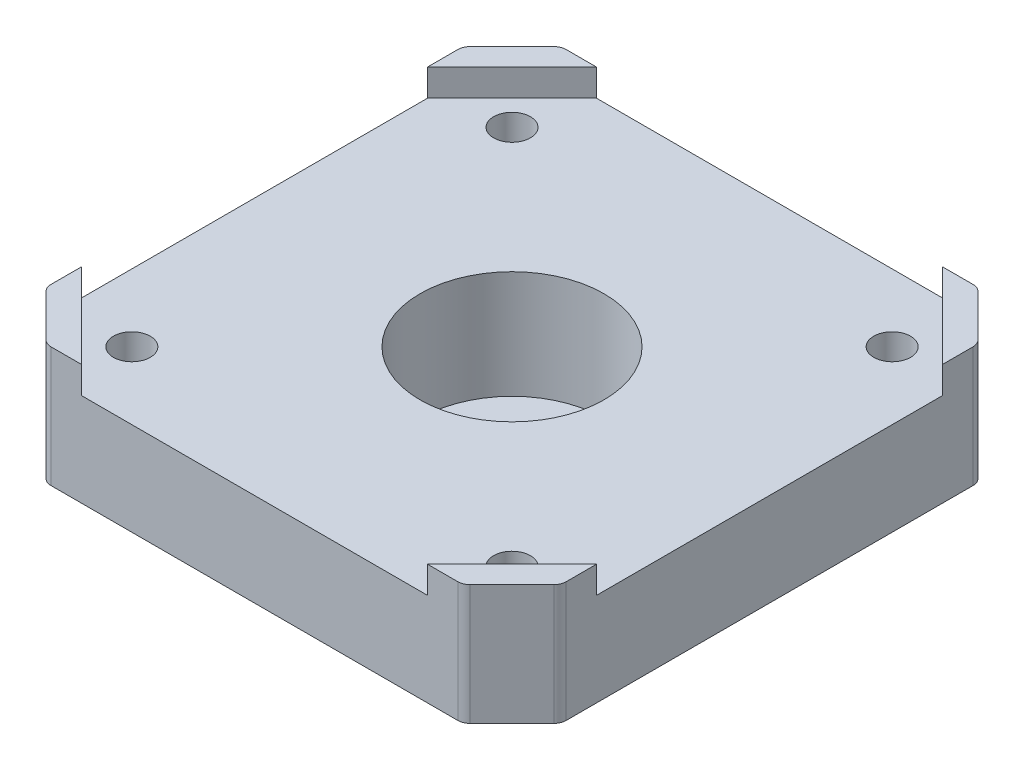
ISO-10303-21;
HEADER;
FILE_DESCRIPTION(('STEP AP214'),'2;1');
FILE_NAME('part.step','',(''),(''),'','','');
FILE_SCHEMA(('AUTOMOTIVE_DESIGN { 1 0 10303 214 1 1 1 1 }'));
ENDSEC;
DATA;
#1=APPLICATION_CONTEXT('core data for automotive mechanical design processes');
#2=APPLICATION_PROTOCOL_DEFINITION('international standard','automotive_design',2000,#1);
#3=PRODUCT_CONTEXT('',#1,'mechanical');
#4=PRODUCT('Part','Part','',(#3));
#5=PRODUCT_RELATED_PRODUCT_CATEGORY('part','',(#4));
#6=PRODUCT_DEFINITION_FORMATION('','',#4);
#7=PRODUCT_DEFINITION_CONTEXT('part definition',#1,'design');
#8=PRODUCT_DEFINITION('design','',#6,#7);
#9=PRODUCT_DEFINITION_SHAPE('','',#8);
#10=(LENGTH_UNIT() NAMED_UNIT(*) SI_UNIT(.MILLI.,.METRE.));
#11=(NAMED_UNIT(*) PLANE_ANGLE_UNIT() SI_UNIT($,.RADIAN.));
#12=(NAMED_UNIT(*) SI_UNIT($,.STERADIAN.) SOLID_ANGLE_UNIT());
#13=UNCERTAINTY_MEASURE_WITH_UNIT(LENGTH_MEASURE(1.E-05),#10,'distance_accuracy_value','');
#14=(GEOMETRIC_REPRESENTATION_CONTEXT(3) GLOBAL_UNCERTAINTY_ASSIGNED_CONTEXT((#13)) GLOBAL_UNIT_ASSIGNED_CONTEXT((#10,
#11,#12)) REPRESENTATION_CONTEXT('',''));
#15=CARTESIAN_POINT('',(0.,0.,0.));
#16=DIRECTION('',(0.,0.,1.));
#17=DIRECTION('',(1.,0.,0.));
#18=AXIS2_PLACEMENT_3D('',#15,#16,#17);
#19=CARTESIAN_POINT('',(0.,-2.20000000000001,0.));
#20=DIRECTION('',(0.,1.,0.));
#21=DIRECTION('',(0.,0.,1.));
#22=AXIS2_PLACEMENT_3D('',#19,#20,#21);
#23=PLANE('',#22);
#24=CARTESIAN_POINT('',(15.5,-2.20000000000001,15.5));
#25=DIRECTION('',(0.,1.,0.));
#26=DIRECTION('',(0.,0.,1.));
#27=AXIS2_PLACEMENT_3D('',#24,#25,#26);
#28=CIRCLE('',#27,1.49999999999999);
#29=CARTESIAN_POINT('',(15.5,-2.20000000000001,17.));
#30=VERTEX_POINT('',#29);
#31=EDGE_CURVE('E512',#30,#30,#28,.T.);
#32=ORIENTED_EDGE('',*,*,#31,.F.);
#33=EDGE_LOOP('',(#32));
#34=FACE_BOUND('',#33,.T.);
#35=CARTESIAN_POINT('',(15.5,-2.2,-15.5));
#36=DIRECTION('',(0.,1.,0.));
#37=DIRECTION('',(0.,0.,1.));
#38=AXIS2_PLACEMENT_3D('',#35,#36,#37);
#39=CIRCLE('',#38,1.49999999999999);
#40=CARTESIAN_POINT('',(15.5,-2.2,-14.));
#41=VERTEX_POINT('',#40);
#42=EDGE_CURVE('E506',#41,#41,#39,.T.);
#43=ORIENTED_EDGE('',*,*,#42,.F.);
#44=EDGE_LOOP('',(#43));
#45=FACE_BOUND('',#44,.T.);
#46=CARTESIAN_POINT('',(-15.5,-2.20000000000001,15.5));
#47=DIRECTION('',(0.,1.,0.));
#48=DIRECTION('',(0.,0.,1.));
#49=AXIS2_PLACEMENT_3D('',#46,#47,#48);
#50=CIRCLE('',#49,1.49999999999999);
#51=CARTESIAN_POINT('',(-15.5,-2.20000000000001,17.));
#52=VERTEX_POINT('',#51);
#53=EDGE_CURVE('E500',#52,#52,#50,.T.);
#54=ORIENTED_EDGE('',*,*,#53,.F.);
#55=EDGE_LOOP('',(#54));
#56=FACE_BOUND('',#55,.T.);
#57=CARTESIAN_POINT('',(-15.5,-2.2,-15.5));
#58=DIRECTION('',(0.,1.,0.));
#59=DIRECTION('',(0.,0.,1.));
#60=AXIS2_PLACEMENT_3D('',#57,#58,#59);
#61=CIRCLE('',#60,1.49999999999999);
#62=CARTESIAN_POINT('',(-15.5,-2.2,-14.));
#63=VERTEX_POINT('',#62);
#64=EDGE_CURVE('E494',#63,#63,#61,.T.);
#65=ORIENTED_EDGE('',*,*,#64,.F.);
#66=EDGE_LOOP('',(#65));
#67=FACE_BOUND('',#66,.T.);
#68=CARTESIAN_POINT('',(0.,-2.20000000000001,0.));
#69=DIRECTION('',(0.,1.,0.));
#70=DIRECTION('',(0.,0.,1.));
#71=AXIS2_PLACEMENT_3D('',#68,#69,#70);
#72=CIRCLE('',#71,7.5);
#73=CARTESIAN_POINT('',(0.,-2.20000000000001,7.5));
#74=VERTEX_POINT('',#73);
#75=EDGE_CURVE('E488',#74,#74,#72,.T.);
#76=ORIENTED_EDGE('',*,*,#75,.F.);
#77=EDGE_LOOP('',(#76));
#78=FACE_BOUND('',#77,.T.);
#79=DIRECTION('',(0.,0.,1.));
#80=VECTOR('',#79,1.);
#81=CARTESIAN_POINT('',(-21.,-2.2,-14.1007806181));
#82=LINE('',#81,#80);
#83=CARTESIAN_POINT('',(-21.,-2.2,-14.1007806181));
#84=VERTEX_POINT('',#83);
#85=CARTESIAN_POINT('',(-21.,-2.20000000000001,14.1007806181));
#86=VERTEX_POINT('',#85);
#87=EDGE_CURVE('E256',#84,#86,#82,.T.);
#88=ORIENTED_EDGE('',*,*,#87,.T.);
#89=DIRECTION('',(-0.707106781186547,0.,-0.707106781186547));
#90=VECTOR('',#89,1.);
#91=CARTESIAN_POINT('',(-21.,-2.20000000000001,14.1007806181));
#92=LINE('',#91,#90);
#93=CARTESIAN_POINT('',(-14.1007806181,-2.20000000000001,21.));
#94=VERTEX_POINT('',#93);
#95=EDGE_CURVE('E207',#94,#86,#92,.T.);
#96=ORIENTED_EDGE('',*,*,#95,.F.);
#97=DIRECTION('',(1.,0.,0.));
#98=VECTOR('',#97,1.);
#99=CARTESIAN_POINT('',(-17.,-2.20000000000001,21.));
#100=LINE('',#99,#98);
#101=CARTESIAN_POINT('',(14.1007806181,-2.20000000000001,21.));
#102=VERTEX_POINT('',#101);
#103=EDGE_CURVE('E222',#94,#102,#100,.T.);
#104=ORIENTED_EDGE('',*,*,#103,.T.);
#105=DIRECTION('',(-0.707106781186547,0.,0.707106781186547));
#106=VECTOR('',#105,1.);
#107=CARTESIAN_POINT('',(14.1007806181,-2.20000000000001,21.));
#108=LINE('',#107,#106);
#109=CARTESIAN_POINT('',(21.,-2.20000000000001,14.1007806181));
#110=VERTEX_POINT('',#109);
#111=EDGE_CURVE('E223',#110,#102,#108,.T.);
#112=ORIENTED_EDGE('',*,*,#111,.F.);
#113=DIRECTION('',(0.,0.,-1.));
#114=VECTOR('',#113,1.);
#115=CARTESIAN_POINT('',(21.,-2.20000000000001,17.));
#116=LINE('',#115,#114);
#117=CARTESIAN_POINT('',(21.,-2.2,-14.1007806181));
#118=VERTEX_POINT('',#117);
#119=EDGE_CURVE('E259',#110,#118,#116,.T.);
#120=ORIENTED_EDGE('',*,*,#119,.T.);
#121=DIRECTION('',(-0.707106781186547,0.,-0.707106781186547));
#122=VECTOR('',#121,1.);
#123=CARTESIAN_POINT('',(21.,-2.2,-14.1007806181));
#124=LINE('',#123,#122);
#125=CARTESIAN_POINT('',(14.1007806181,-2.2,-21.));
#126=VERTEX_POINT('',#125);
#127=EDGE_CURVE('E246',#118,#126,#124,.T.);
#128=ORIENTED_EDGE('',*,*,#127,.T.);
#129=DIRECTION('',(-1.,0.,0.));
#130=VECTOR('',#129,1.);
#131=CARTESIAN_POINT('',(14.1007806181,-2.2,-21.));
#132=LINE('',#131,#130);
#133=CARTESIAN_POINT('',(-14.1007806181,-2.2,-21.));
#134=VERTEX_POINT('',#133);
#135=EDGE_CURVE('E249',#126,#134,#132,.T.);
#136=ORIENTED_EDGE('',*,*,#135,.T.);
#137=DIRECTION('',(-0.707106781186547,0.,0.707106781186547));
#138=VECTOR('',#137,1.);
#139=CARTESIAN_POINT('',(-14.1007806181,-2.2,-21.));
#140=LINE('',#139,#138);
#141=EDGE_CURVE('E253',#134,#84,#140,.T.);
#142=ORIENTED_EDGE('',*,*,#141,.T.);
#143=EDGE_LOOP('',(#88,#96,#104,#112,#120,#128,#136,#142));
#144=FACE_BOUND('',#143,.T.);
#145=ADVANCED_FACE('F35',(#34,#45,#56,#67,#78,#144),#23,.T.);
#146=CARTESIAN_POINT('',(17.,-9.79999999999999,21.));
#147=DIRECTION('',(0.707106781186548,0.,0.707106781186547));
#148=DIRECTION('',(0.707106781186547,0.,-0.707106781186548));
#149=AXIS2_PLACEMENT_3D('',#146,#147,#148);
#150=PLANE('',#149);
#151=DIRECTION('',(0.707106781186547,0.,-0.707106781186548));
#152=VECTOR('',#151,1.);
#153=CARTESIAN_POINT('',(21.,0.,17.));
#154=LINE('',#153,#152);
#155=CARTESIAN_POINT('',(17.2928932188135,0.,20.7071067811865));
#156=VERTEX_POINT('',#155);
#157=CARTESIAN_POINT('',(20.7071067811865,0.,17.2928932188135));
#158=VERTEX_POINT('',#157);
#159=EDGE_CURVE('E234',#156,#158,#154,.T.);
#160=ORIENTED_EDGE('',*,*,#159,.F.);
#161=DIRECTION('',(0.,1.,0.));
#162=VECTOR('',#161,1.);
#163=CARTESIAN_POINT('',(17.2928932188135,-9.79999999999999,20.7071067811865));
#164=LINE('',#163,#162);
#165=CARTESIAN_POINT('',(17.2928932188135,-9.79999999999999,20.7071067811865));
#166=VERTEX_POINT('',#165);
#167=EDGE_CURVE('E372',#156,#166,#164,.F.);
#168=ORIENTED_EDGE('',*,*,#167,.T.);
#169=DIRECTION('',(0.707106781186547,0.,-0.707106781186548));
#170=VECTOR('',#169,1.);
#171=CARTESIAN_POINT('',(17.,-9.79999999999999,21.));
#172=LINE('',#171,#170);
#173=CARTESIAN_POINT('',(20.7071067811865,-9.79999999999999,17.2928932188135));
#174=VERTEX_POINT('',#173);
#175=EDGE_CURVE('E289',#166,#174,#172,.T.);
#176=ORIENTED_EDGE('',*,*,#175,.T.);
#177=DIRECTION('',(0.,1.,0.));
#178=VECTOR('',#177,1.);
#179=CARTESIAN_POINT('',(20.7071067811865,-9.79999999999999,17.2928932188135));
#180=LINE('',#179,#178);
#181=EDGE_CURVE('E369',#174,#158,#180,.T.);
#182=ORIENTED_EDGE('',*,*,#181,.T.);
#183=EDGE_LOOP('',(#160,#168,#176,#182));
#184=FACE_BOUND('',#183,.T.);
#185=ADVANCED_FACE('F447',(#184),#150,.T.);
#186=CARTESIAN_POINT('',(-17.,-9.79999999999999,21.));
#187=DIRECTION('',(0.,0.,1.));
#188=DIRECTION('',(1.,0.,0.));
#189=AXIS2_PLACEMENT_3D('',#186,#187,#188);
#190=PLANE('',#189);
#191=DIRECTION('',(1.,0.,0.));
#192=VECTOR('',#191,1.);
#193=CARTESIAN_POINT('',(-14.1007806181,0.,21.));
#194=LINE('',#193,#192);
#195=CARTESIAN_POINT('',(-16.5857864376269,0.,21.));
#196=VERTEX_POINT('',#195);
#197=CARTESIAN_POINT('',(-14.1007806181,0.,21.));
#198=VERTEX_POINT('',#197);
#199=EDGE_CURVE('E196',#196,#198,#194,.T.);
#200=ORIENTED_EDGE('',*,*,#199,.F.);
#201=DIRECTION('',(0.,1.,0.));
#202=VECTOR('',#201,1.);
#203=CARTESIAN_POINT('',(-16.5857864376269,-9.79999999999999,21.));
#204=LINE('',#203,#202);
#205=CARTESIAN_POINT('',(-16.5857864376269,-9.79999999999999,21.));
#206=VERTEX_POINT('',#205);
#207=EDGE_CURVE('E328',#196,#206,#204,.F.);
#208=ORIENTED_EDGE('',*,*,#207,.T.);
#209=DIRECTION('',(1.,0.,0.));
#210=VECTOR('',#209,1.);
#211=CARTESIAN_POINT('',(-17.,-9.79999999999999,21.));
#212=LINE('',#211,#210);
#213=CARTESIAN_POINT('',(16.5857864376269,-9.79999999999999,21.));
#214=VERTEX_POINT('',#213);
#215=EDGE_CURVE('E286',#206,#214,#212,.T.);
#216=ORIENTED_EDGE('',*,*,#215,.T.);
#217=DIRECTION('',(0.,1.,0.));
#218=VECTOR('',#217,1.);
#219=CARTESIAN_POINT('',(16.5857864376269,-9.79999999999999,21.));
#220=LINE('',#219,#218);
#221=CARTESIAN_POINT('',(16.5857864376269,0.,21.));
#222=VERTEX_POINT('',#221);
#223=EDGE_CURVE('E325',#214,#222,#220,.T.);
#224=ORIENTED_EDGE('',*,*,#223,.T.);
#225=DIRECTION('',(1.,0.,0.));
#226=VECTOR('',#225,1.);
#227=CARTESIAN_POINT('',(17.,0.,21.));
#228=LINE('',#227,#226);
#229=CARTESIAN_POINT('',(14.1007806181,0.,21.));
#230=VERTEX_POINT('',#229);
#231=EDGE_CURVE('E226',#230,#222,#228,.T.);
#232=ORIENTED_EDGE('',*,*,#231,.F.);
#233=DIRECTION('',(0.,-1.,0.));
#234=VECTOR('',#233,1.);
#235=CARTESIAN_POINT('',(14.1007806181,0.,21.));
#236=LINE('',#235,#234);
#237=EDGE_CURVE('E240',#230,#102,#236,.T.);
#238=ORIENTED_EDGE('',*,*,#237,.T.);
#239=ORIENTED_EDGE('',*,*,#103,.F.);
#240=DIRECTION('',(0.,-1.,0.));
#241=VECTOR('',#240,1.);
#242=CARTESIAN_POINT('',(-14.1007806181,0.,21.));
#243=LINE('',#242,#241);
#244=EDGE_CURVE('E213',#198,#94,#243,.T.);
#245=ORIENTED_EDGE('',*,*,#244,.F.);
#246=EDGE_LOOP('',(#200,#208,#216,#224,#232,#238,#239,#245));
#247=FACE_BOUND('',#246,.T.);
#248=ADVANCED_FACE('F220',(#247),#190,.T.);
#249=CARTESIAN_POINT('',(-21.,-9.79999999999999,17.));
#250=DIRECTION('',(-0.707106781186548,0.,0.707106781186548));
#251=DIRECTION('',(0.707106781186548,0.,0.707106781186548));
#252=AXIS2_PLACEMENT_3D('',#249,#250,#251);
#253=PLANE('',#252);
#254=DIRECTION('',(0.707106781186547,0.,0.707106781186547));
#255=VECTOR('',#254,1.);
#256=CARTESIAN_POINT('',(-21.,-9.79999999999999,17.));
#257=LINE('',#256,#255);
#258=CARTESIAN_POINT('',(-20.7071067811866,-9.79999999999999,17.2928932188134));
#259=VERTEX_POINT('',#258);
#260=CARTESIAN_POINT('',(-17.2928932188135,-9.79999999999999,20.7071067811865));
#261=VERTEX_POINT('',#260);
#262=EDGE_CURVE('E283',#259,#261,#257,.T.);
#263=ORIENTED_EDGE('',*,*,#262,.T.);
#264=DIRECTION('',(0.,1.,0.));
#265=VECTOR('',#264,1.);
#266=CARTESIAN_POINT('',(-17.2928932188135,-9.79999999999999,20.7071067811865));
#267=LINE('',#266,#265);
#268=CARTESIAN_POINT('',(-17.2928932188135,0.,20.7071067811865));
#269=VERTEX_POINT('',#268);
#270=EDGE_CURVE('E319',#261,#269,#267,.T.);
#271=ORIENTED_EDGE('',*,*,#270,.T.);
#272=DIRECTION('',(0.707106781186547,0.,0.707106781186547));
#273=VECTOR('',#272,1.);
#274=CARTESIAN_POINT('',(-17.,0.,21.));
#275=LINE('',#274,#273);
#276=CARTESIAN_POINT('',(-20.7071067811866,0.,17.2928932188134));
#277=VERTEX_POINT('',#276);
#278=EDGE_CURVE('E228',#277,#269,#275,.T.);
#279=ORIENTED_EDGE('',*,*,#278,.F.);
#280=DIRECTION('',(0.,1.,0.));
#281=VECTOR('',#280,1.);
#282=CARTESIAN_POINT('',(-20.7071067811866,-9.79999999999999,17.2928932188134));
#283=LINE('',#282,#281);
#284=EDGE_CURVE('E317',#277,#259,#283,.F.);
#285=ORIENTED_EDGE('',*,*,#284,.T.);
#286=EDGE_LOOP('',(#263,#271,#279,#285));
#287=FACE_BOUND('',#286,.T.);
#288=ADVANCED_FACE('F463',(#287),#253,.T.);
#289=CARTESIAN_POINT('',(0.,0.,0.));
#290=DIRECTION('',(0.,1.,0.));
#291=DIRECTION('',(0.,0.,1.));
#292=AXIS2_PLACEMENT_3D('',#289,#290,#291);
#293=PLANE('',#292);
#294=DIRECTION('',(0.,0.,-1.));
#295=VECTOR('',#294,1.);
#296=CARTESIAN_POINT('',(21.,0.,17.));
#297=LINE('',#296,#295);
#298=CARTESIAN_POINT('',(21.,0.,-14.1007806181));
#299=VERTEX_POINT('',#298);
#300=CARTESIAN_POINT('',(21.,0.,-16.5857864376269));
#301=VERTEX_POINT('',#300);
#302=EDGE_CURVE('E306',#299,#301,#297,.T.);
#303=ORIENTED_EDGE('',*,*,#302,.T.);
#304=CARTESIAN_POINT('',(20.,0.,-16.5857864376269));
#305=DIRECTION('',(0.,1.,0.));
#306=DIRECTION('',(0.,0.,1.));
#307=AXIS2_PLACEMENT_3D('',#304,#305,#306);
#308=CIRCLE('',#307,1.);
#309=CARTESIAN_POINT('',(20.7071067811865,0.,-17.2928932188135));
#310=VERTEX_POINT('',#309);
#311=EDGE_CURVE('E58',#301,#310,#308,.T.);
#312=ORIENTED_EDGE('',*,*,#311,.T.);
#313=DIRECTION('',(-0.707106781186548,0.,-0.707106781186547));
#314=VECTOR('',#313,1.);
#315=CARTESIAN_POINT('',(21.,0.,-17.));
#316=LINE('',#315,#314);
#317=CARTESIAN_POINT('',(17.2928932188134,0.,-20.7071067811866));
#318=VERTEX_POINT('',#317);
#319=EDGE_CURVE('E308',#310,#318,#316,.T.);
#320=ORIENTED_EDGE('',*,*,#319,.T.);
#321=CARTESIAN_POINT('',(16.5857864376269,0.,-20.));
#322=DIRECTION('',(0.,1.,0.));
#323=DIRECTION('',(0.,0.,1.));
#324=AXIS2_PLACEMENT_3D('',#321,#322,#323);
#325=CIRCLE('',#324,1.);
#326=CARTESIAN_POINT('',(16.5857864376269,0.,-21.));
#327=VERTEX_POINT('',#326);
#328=EDGE_CURVE('E50',#318,#327,#325,.T.);
#329=ORIENTED_EDGE('',*,*,#328,.T.);
#330=DIRECTION('',(-1.,0.,0.));
#331=VECTOR('',#330,1.);
#332=CARTESIAN_POINT('',(17.,0.,-21.));
#333=LINE('',#332,#331);
#334=CARTESIAN_POINT('',(14.1007806181,0.,-21.));
#335=VERTEX_POINT('',#334);
#336=EDGE_CURVE('E280',#327,#335,#333,.T.);
#337=ORIENTED_EDGE('',*,*,#336,.T.);
#338=DIRECTION('',(-0.707106781186547,0.,-0.707106781186547));
#339=VECTOR('',#338,1.);
#340=CARTESIAN_POINT('',(21.,0.,-14.1007806181));
#341=LINE('',#340,#339);
#342=EDGE_CURVE('E245',#299,#335,#341,.T.);
#343=ORIENTED_EDGE('',*,*,#342,.F.);
#344=EDGE_LOOP('',(#303,#312,#320,#329,#337,#343));
#345=FACE_BOUND('',#344,.T.);
#346=ADVANCED_FACE('F385',(#345),#293,.T.);
#347=CARTESIAN_POINT('',(-17.,-9.79999999999999,-21.));
#348=DIRECTION('',(-0.707106781186548,0.,-0.707106781186548));
#349=DIRECTION('',(-0.707106781186548,0.,0.707106781186548));
#350=AXIS2_PLACEMENT_3D('',#347,#348,#349);
#351=PLANE('',#350);
#352=DIRECTION('',(-0.707106781186547,0.,0.707106781186547));
#353=VECTOR('',#352,1.);
#354=CARTESIAN_POINT('',(-17.,-9.79999999999999,-21.));
#355=LINE('',#354,#353);
#356=CARTESIAN_POINT('',(-17.2928932188135,-9.79999999999999,-20.7071067811865));
#357=VERTEX_POINT('',#356);
#358=CARTESIAN_POINT('',(-20.7071067811865,-9.79999999999999,-17.2928932188135));
#359=VERTEX_POINT('',#358);
#360=EDGE_CURVE('E276',#357,#359,#355,.T.);
#361=ORIENTED_EDGE('',*,*,#360,.T.);
#362=DIRECTION('',(0.,1.,0.));
#363=VECTOR('',#362,1.);
#364=CARTESIAN_POINT('',(-20.7071067811865,-9.79999999999999,-17.2928932188135));
#365=LINE('',#364,#363);
#366=CARTESIAN_POINT('',(-20.7071067811865,0.,-17.2928932188135));
#367=VERTEX_POINT('',#366);
#368=EDGE_CURVE('E348',#359,#367,#365,.T.);
#369=ORIENTED_EDGE('',*,*,#368,.T.);
#370=DIRECTION('',(-0.707106781186547,0.,0.707106781186547));
#371=VECTOR('',#370,1.);
#372=CARTESIAN_POINT('',(-17.,0.,-21.));
#373=LINE('',#372,#371);
#374=CARTESIAN_POINT('',(-17.2928932188135,0.,-20.7071067811865));
#375=VERTEX_POINT('',#374);
#376=EDGE_CURVE('E268',#375,#367,#373,.T.);
#377=ORIENTED_EDGE('',*,*,#376,.F.);
#378=DIRECTION('',(0.,1.,0.));
#379=VECTOR('',#378,1.);
#380=CARTESIAN_POINT('',(-17.2928932188134,-9.79999999999999,-20.7071067811866));
#381=LINE('',#380,#379);
#382=EDGE_CURVE('E346',#375,#357,#381,.F.);
#383=ORIENTED_EDGE('',*,*,#382,.T.);
#384=EDGE_LOOP('',(#361,#369,#377,#383));
#385=FACE_BOUND('',#384,.T.);
#386=ADVANCED_FACE('F409',(#385),#351,.T.);
#387=CARTESIAN_POINT('',(17.,-9.79999999999999,-21.));
#388=DIRECTION('',(0.,0.,-1.));
#389=DIRECTION('',(-1.,0.,0.));
#390=AXIS2_PLACEMENT_3D('',#387,#388,#389);
#391=PLANE('',#390);
#392=DIRECTION('',(-1.,0.,0.));
#393=VECTOR('',#392,1.);
#394=CARTESIAN_POINT('',(17.,-9.79999999999999,-21.));
#395=LINE('',#394,#393);
#396=CARTESIAN_POINT('',(16.5857864376269,-9.79999999999999,-21.));
#397=VERTEX_POINT('',#396);
#398=CARTESIAN_POINT('',(-16.5857864376269,-9.79999999999999,-21.));
#399=VERTEX_POINT('',#398);
#400=EDGE_CURVE('E298',#397,#399,#395,.T.);
#401=ORIENTED_EDGE('',*,*,#400,.T.);
#402=DIRECTION('',(0.,1.,0.));
#403=VECTOR('',#402,1.);
#404=CARTESIAN_POINT('',(-16.5857864376269,-9.79999999999999,-21.));
#405=LINE('',#404,#403);
#406=CARTESIAN_POINT('',(-16.5857864376269,0.,-21.));
#407=VERTEX_POINT('',#406);
#408=EDGE_CURVE('E362',#399,#407,#405,.T.);
#409=ORIENTED_EDGE('',*,*,#408,.T.);
#410=CARTESIAN_POINT('',(-14.1007806181,0.,-21.));
#411=VERTEX_POINT('',#410);
#412=EDGE_CURVE('E310',#411,#407,#333,.T.);
#413=ORIENTED_EDGE('',*,*,#412,.F.);
#414=DIRECTION('',(0.,1.,0.));
#415=VECTOR('',#414,1.);
#416=CARTESIAN_POINT('',(-14.1007806181,-2.2,-21.));
#417=LINE('',#416,#415);
#418=EDGE_CURVE('E272',#134,#411,#417,.T.);
#419=ORIENTED_EDGE('',*,*,#418,.F.);
#420=ORIENTED_EDGE('',*,*,#135,.F.);
#421=DIRECTION('',(0.,1.,0.));
#422=VECTOR('',#421,1.);
#423=CARTESIAN_POINT('',(14.1007806181,-2.2,-21.));
#424=LINE('',#423,#422);
#425=EDGE_CURVE('E261',#126,#335,#424,.T.);
#426=ORIENTED_EDGE('',*,*,#425,.T.);
#427=ORIENTED_EDGE('',*,*,#336,.F.);
#428=DIRECTION('',(0.,1.,0.));
#429=VECTOR('',#428,1.);
#430=CARTESIAN_POINT('',(16.5857864376269,-9.79999999999999,-21.));
#431=LINE('',#430,#429);
#432=EDGE_CURVE('E360',#327,#397,#431,.F.);
#433=ORIENTED_EDGE('',*,*,#432,.T.);
#434=EDGE_LOOP('',(#401,#409,#413,#419,#420,#426,#427,#433));
#435=FACE_BOUND('',#434,.T.);
#436=ADVANCED_FACE('F389',(#435),#391,.T.);
#437=CARTESIAN_POINT('',(21.,-9.79999999999999,-17.));
#438=DIRECTION('',(0.707106781186547,0.,-0.707106781186548));
#439=DIRECTION('',(-0.707106781186548,0.,-0.707106781186547));
#440=AXIS2_PLACEMENT_3D('',#437,#438,#439);
#441=PLANE('',#440);
#442=ORIENTED_EDGE('',*,*,#319,.F.);
#443=DIRECTION('',(0.,1.,0.));
#444=VECTOR('',#443,1.);
#445=CARTESIAN_POINT('',(20.7071067811865,-9.79999999999999,-17.2928932188135));
#446=LINE('',#445,#444);
#447=CARTESIAN_POINT('',(20.7071067811865,-9.79999999999999,-17.2928932188135));
#448=VERTEX_POINT('',#447);
#449=EDGE_CURVE('E11',#310,#448,#446,.F.);
#450=ORIENTED_EDGE('',*,*,#449,.T.);
#451=DIRECTION('',(-0.707106781186548,0.,-0.707106781186547));
#452=VECTOR('',#451,1.);
#453=CARTESIAN_POINT('',(21.,-9.79999999999999,-17.));
#454=LINE('',#453,#452);
#455=CARTESIAN_POINT('',(17.2928932188134,-9.79999999999999,-20.7071067811866));
#456=VERTEX_POINT('',#455);
#457=EDGE_CURVE('E295',#448,#456,#454,.T.);
#458=ORIENTED_EDGE('',*,*,#457,.T.);
#459=DIRECTION('',(0.,1.,0.));
#460=VECTOR('',#459,1.);
#461=CARTESIAN_POINT('',(17.2928932188134,-9.79999999999999,-20.7071067811866));
#462=LINE('',#461,#460);
#463=EDGE_CURVE('E43',#456,#318,#462,.T.);
#464=ORIENTED_EDGE('',*,*,#463,.T.);
#465=EDGE_LOOP('',(#442,#450,#458,#464));
#466=FACE_BOUND('',#465,.T.);
#467=ADVANCED_FACE('F381',(#466),#441,.T.);
#468=CARTESIAN_POINT('',(21.,-9.79999999999999,17.));
#469=DIRECTION('',(1.,0.,0.));
#470=DIRECTION('',(0.,0.,-1.));
#471=AXIS2_PLACEMENT_3D('',#468,#469,#470);
#472=PLANE('',#471);
#473=DIRECTION('',(0.,0.,-1.));
#474=VECTOR('',#473,1.);
#475=CARTESIAN_POINT('',(21.,0.,14.1007806181));
#476=LINE('',#475,#474);
#477=CARTESIAN_POINT('',(21.,0.,16.5857864376269));
#478=VERTEX_POINT('',#477);
#479=CARTESIAN_POINT('',(21.,0.,14.1007806181));
#480=VERTEX_POINT('',#479);
#481=EDGE_CURVE('E237',#478,#480,#476,.T.);
#482=ORIENTED_EDGE('',*,*,#481,.F.);
#483=DIRECTION('',(0.,1.,0.));
#484=VECTOR('',#483,1.);
#485=CARTESIAN_POINT('',(21.,-9.79999999999999,16.5857864376269));
#486=LINE('',#485,#484);
#487=CARTESIAN_POINT('',(21.,-9.79999999999999,16.5857864376269));
#488=VERTEX_POINT('',#487);
#489=EDGE_CURVE('E377',#478,#488,#486,.F.);
#490=ORIENTED_EDGE('',*,*,#489,.T.);
#491=DIRECTION('',(0.,0.,-1.));
#492=VECTOR('',#491,1.);
#493=CARTESIAN_POINT('',(21.,-9.79999999999999,17.));
#494=LINE('',#493,#492);
#495=CARTESIAN_POINT('',(21.,-9.79999999999999,-16.5857864376269));
#496=VERTEX_POINT('',#495);
#497=EDGE_CURVE('E292',#488,#496,#494,.T.);
#498=ORIENTED_EDGE('',*,*,#497,.T.);
#499=DIRECTION('',(0.,1.,0.));
#500=VECTOR('',#499,1.);
#501=CARTESIAN_POINT('',(21.,-9.79999999999999,-16.5857864376269));
#502=LINE('',#501,#500);
#503=EDGE_CURVE('E374',#496,#301,#502,.T.);
#504=ORIENTED_EDGE('',*,*,#503,.T.);
#505=ORIENTED_EDGE('',*,*,#302,.F.);
#506=DIRECTION('',(0.,1.,0.));
#507=VECTOR('',#506,1.);
#508=CARTESIAN_POINT('',(21.,-2.2,-14.1007806181));
#509=LINE('',#508,#507);
#510=EDGE_CURVE('E266',#118,#299,#509,.T.);
#511=ORIENTED_EDGE('',*,*,#510,.F.);
#512=ORIENTED_EDGE('',*,*,#119,.F.);
#513=DIRECTION('',(0.,-1.,0.));
#514=VECTOR('',#513,1.);
#515=CARTESIAN_POINT('',(21.,0.,14.1007806181));
#516=LINE('',#515,#514);
#517=EDGE_CURVE('E243',#480,#110,#516,.T.);
#518=ORIENTED_EDGE('',*,*,#517,.F.);
#519=EDGE_LOOP('',(#482,#490,#498,#504,#505,#511,#512,#518));
#520=FACE_BOUND('',#519,.T.);
#521=ADVANCED_FACE('F433',(#520),#472,.T.);
#522=CARTESIAN_POINT('',(-21.,-9.79999999999999,-17.));
#523=DIRECTION('',(-1.,0.,0.));
#524=DIRECTION('',(0.,0.,1.));
#525=AXIS2_PLACEMENT_3D('',#522,#523,#524);
#526=PLANE('',#525);
#527=DIRECTION('',(0.,0.,1.));
#528=VECTOR('',#527,1.);
#529=CARTESIAN_POINT('',(-21.,0.,-17.));
#530=LINE('',#529,#528);
#531=CARTESIAN_POINT('',(-21.,0.,-16.5857864376269));
#532=VERTEX_POINT('',#531);
#533=CARTESIAN_POINT('',(-21.,0.,-14.1007806181));
#534=VERTEX_POINT('',#533);
#535=EDGE_CURVE('E304',#532,#534,#530,.T.);
#536=ORIENTED_EDGE('',*,*,#535,.F.);
#537=DIRECTION('',(0.,1.,0.));
#538=VECTOR('',#537,1.);
#539=CARTESIAN_POINT('',(-21.,-9.79999999999999,-16.5857864376269));
#540=LINE('',#539,#538);
#541=CARTESIAN_POINT('',(-21.,-9.79999999999999,-16.5857864376269));
#542=VERTEX_POINT('',#541);
#543=EDGE_CURVE('E358',#532,#542,#540,.F.);
#544=ORIENTED_EDGE('',*,*,#543,.T.);
#545=DIRECTION('',(0.,0.,1.));
#546=VECTOR('',#545,1.);
#547=CARTESIAN_POINT('',(-21.,-9.79999999999999,-17.));
#548=LINE('',#547,#546);
#549=CARTESIAN_POINT('',(-21.,-9.79999999999999,16.5857864376269));
#550=VERTEX_POINT('',#549);
#551=EDGE_CURVE('E279',#542,#550,#548,.T.);
#552=ORIENTED_EDGE('',*,*,#551,.T.);
#553=DIRECTION('',(0.,1.,0.));
#554=VECTOR('',#553,1.);
#555=CARTESIAN_POINT('',(-21.,-9.79999999999999,16.5857864376269));
#556=LINE('',#555,#554);
#557=CARTESIAN_POINT('',(-21.,0.,16.5857864376269));
#558=VERTEX_POINT('',#557);
#559=EDGE_CURVE('E355',#550,#558,#556,.T.);
#560=ORIENTED_EDGE('',*,*,#559,.T.);
#561=DIRECTION('',(0.,0.,1.));
#562=VECTOR('',#561,1.);
#563=CARTESIAN_POINT('',(-21.,0.,17.));
#564=LINE('',#563,#562);
#565=CARTESIAN_POINT('',(-21.,0.,14.1007806181));
#566=VERTEX_POINT('',#565);
#567=EDGE_CURVE('E217',#566,#558,#564,.T.);
#568=ORIENTED_EDGE('',*,*,#567,.F.);
#569=DIRECTION('',(0.,-1.,0.));
#570=VECTOR('',#569,1.);
#571=CARTESIAN_POINT('',(-21.,0.,14.1007806181));
#572=LINE('',#571,#570);
#573=EDGE_CURVE('E215',#566,#86,#572,.T.);
#574=ORIENTED_EDGE('',*,*,#573,.T.);
#575=ORIENTED_EDGE('',*,*,#87,.F.);
#576=DIRECTION('',(0.,1.,0.));
#577=VECTOR('',#576,1.);
#578=CARTESIAN_POINT('',(-21.,-2.2,-14.1007806181));
#579=LINE('',#578,#577);
#580=EDGE_CURVE('E269',#84,#534,#579,.T.);
#581=ORIENTED_EDGE('',*,*,#580,.T.);
#582=EDGE_LOOP('',(#536,#544,#552,#560,#568,#574,#575,#581));
#583=FACE_BOUND('',#582,.T.);
#584=ADVANCED_FACE('F417',(#583),#526,.T.);
#585=CARTESIAN_POINT('',(0.,-9.79999999999999,0.));
#586=DIRECTION('',(0.,1.,0.));
#587=DIRECTION('',(0.,0.,1.));
#588=AXIS2_PLACEMENT_3D('',#585,#586,#587);
#589=PLANE('',#588);
#590=CARTESIAN_POINT('',(15.5,-9.79999999999999,15.5));
#591=DIRECTION('',(0.,1.,0.));
#592=DIRECTION('',(0.,0.,1.));
#593=AXIS2_PLACEMENT_3D('',#590,#591,#592);
#594=CIRCLE('',#593,1.49999999999999);
#595=CARTESIAN_POINT('',(15.5,-9.79999999999999,17.));
#596=VERTEX_POINT('',#595);
#597=EDGE_CURVE('E509',#596,#596,#594,.T.);
#598=ORIENTED_EDGE('',*,*,#597,.T.);
#599=EDGE_LOOP('',(#598));
#600=FACE_BOUND('',#599,.T.);
#601=CARTESIAN_POINT('',(15.5,-9.79999999999999,-15.5));
#602=DIRECTION('',(0.,1.,0.));
#603=DIRECTION('',(0.,0.,1.));
#604=AXIS2_PLACEMENT_3D('',#601,#602,#603);
#605=CIRCLE('',#604,1.49999999999999);
#606=CARTESIAN_POINT('',(15.5,-9.79999999999999,-14.));
#607=VERTEX_POINT('',#606);
#608=EDGE_CURVE('E503',#607,#607,#605,.T.);
#609=ORIENTED_EDGE('',*,*,#608,.T.);
#610=EDGE_LOOP('',(#609));
#611=FACE_BOUND('',#610,.T.);
#612=CARTESIAN_POINT('',(-15.5,-9.79999999999999,15.5));
#613=DIRECTION('',(0.,1.,0.));
#614=DIRECTION('',(0.,0.,1.));
#615=AXIS2_PLACEMENT_3D('',#612,#613,#614);
#616=CIRCLE('',#615,1.49999999999999);
#617=CARTESIAN_POINT('',(-15.5,-9.79999999999999,17.));
#618=VERTEX_POINT('',#617);
#619=EDGE_CURVE('E497',#618,#618,#616,.T.);
#620=ORIENTED_EDGE('',*,*,#619,.T.);
#621=EDGE_LOOP('',(#620));
#622=FACE_BOUND('',#621,.T.);
#623=CARTESIAN_POINT('',(-15.5,-9.79999999999999,-15.5));
#624=DIRECTION('',(0.,1.,0.));
#625=DIRECTION('',(0.,0.,1.));
#626=AXIS2_PLACEMENT_3D('',#623,#624,#625);
#627=CIRCLE('',#626,1.49999999999999);
#628=CARTESIAN_POINT('',(-15.5,-9.79999999999999,-14.));
#629=VERTEX_POINT('',#628);
#630=EDGE_CURVE('E491',#629,#629,#627,.T.);
#631=ORIENTED_EDGE('',*,*,#630,.T.);
#632=EDGE_LOOP('',(#631));
#633=FACE_BOUND('',#632,.T.);
#634=CARTESIAN_POINT('',(0.,-9.79999999999999,0.));
#635=DIRECTION('',(0.,-1.,0.));
#636=DIRECTION('',(0.,0.,-1.));
#637=AXIS2_PLACEMENT_3D('',#634,#635,#636);
#638=CIRCLE('',#637,13.93605);
#639=CARTESIAN_POINT('',(0.,-9.79999999999999,-13.93605));
#640=VERTEX_POINT('',#639);
#641=EDGE_CURVE('E469',#640,#640,#638,.T.);
#642=ORIENTED_EDGE('',*,*,#641,.F.);
#643=EDGE_LOOP('',(#642));
#644=FACE_BOUND('',#643,.T.);
#645=ORIENTED_EDGE('',*,*,#215,.F.);
#646=CARTESIAN_POINT('',(-16.5857864376269,-9.79999999999999,20.));
#647=DIRECTION('',(0.,1.,0.));
#648=DIRECTION('',(0.,0.,1.));
#649=AXIS2_PLACEMENT_3D('',#646,#647,#648);
#650=CIRCLE('',#649,1.);
#651=EDGE_CURVE('E344',#206,#261,#650,.F.);
#652=ORIENTED_EDGE('',*,*,#651,.T.);
#653=ORIENTED_EDGE('',*,*,#262,.F.);
#654=CARTESIAN_POINT('',(-20.,-9.79999999999999,16.5857864376269));
#655=DIRECTION('',(0.,1.,0.));
#656=DIRECTION('',(0.,0.,1.));
#657=AXIS2_PLACEMENT_3D('',#654,#655,#656);
#658=CIRCLE('',#657,1.);
#659=EDGE_CURVE('E336',#259,#550,#658,.F.);
#660=ORIENTED_EDGE('',*,*,#659,.T.);
#661=ORIENTED_EDGE('',*,*,#551,.F.);
#662=CARTESIAN_POINT('',(-20.,-9.79999999999999,-16.5857864376269));
#663=DIRECTION('',(0.,1.,0.));
#664=DIRECTION('',(0.,0.,1.));
#665=AXIS2_PLACEMENT_3D('',#662,#663,#664);
#666=CIRCLE('',#665,1.);
#667=EDGE_CURVE('E342',#542,#359,#666,.F.);
#668=ORIENTED_EDGE('',*,*,#667,.T.);
#669=ORIENTED_EDGE('',*,*,#360,.F.);
#670=CARTESIAN_POINT('',(-16.5857864376269,-9.79999999999999,-20.));
#671=DIRECTION('',(0.,1.,0.));
#672=DIRECTION('',(0.,0.,1.));
#673=AXIS2_PLACEMENT_3D('',#670,#671,#672);
#674=CIRCLE('',#673,1.);
#675=EDGE_CURVE('E340',#357,#399,#674,.F.);
#676=ORIENTED_EDGE('',*,*,#675,.T.);
#677=ORIENTED_EDGE('',*,*,#400,.F.);
#678=CARTESIAN_POINT('',(16.5857864376269,-9.79999999999999,-20.));
#679=DIRECTION('',(0.,1.,0.));
#680=DIRECTION('',(0.,0.,1.));
#681=AXIS2_PLACEMENT_3D('',#678,#679,#680);
#682=CIRCLE('',#681,1.);
#683=EDGE_CURVE('E330',#397,#456,#682,.F.);
#684=ORIENTED_EDGE('',*,*,#683,.T.);
#685=ORIENTED_EDGE('',*,*,#457,.F.);
#686=CARTESIAN_POINT('',(20.,-9.79999999999999,-16.5857864376269));
#687=DIRECTION('',(0.,1.,0.));
#688=DIRECTION('',(0.,0.,1.));
#689=AXIS2_PLACEMENT_3D('',#686,#687,#688);
#690=CIRCLE('',#689,1.);
#691=EDGE_CURVE('E332',#448,#496,#690,.F.);
#692=ORIENTED_EDGE('',*,*,#691,.T.);
#693=ORIENTED_EDGE('',*,*,#497,.F.);
#694=CARTESIAN_POINT('',(20.,-9.79999999999999,16.5857864376269));
#695=DIRECTION('',(0.,1.,0.));
#696=DIRECTION('',(0.,0.,1.));
#697=AXIS2_PLACEMENT_3D('',#694,#695,#696);
#698=CIRCLE('',#697,1.);
#699=EDGE_CURVE('E334',#488,#174,#698,.F.);
#700=ORIENTED_EDGE('',*,*,#699,.T.);
#701=ORIENTED_EDGE('',*,*,#175,.F.);
#702=CARTESIAN_POINT('',(16.5857864376269,-9.79999999999999,20.));
#703=DIRECTION('',(0.,1.,0.));
#704=DIRECTION('',(0.,0.,1.));
#705=AXIS2_PLACEMENT_3D('',#702,#703,#704);
#706=CIRCLE('',#705,1.);
#707=EDGE_CURVE('E338',#166,#214,#706,.F.);
#708=ORIENTED_EDGE('',*,*,#707,.T.);
#709=EDGE_LOOP('',(#645,#652,#653,#660,#661,#668,#669,#676,#677,#684,#685,#692,#693,#700,#701,#708));
#710=FACE_BOUND('',#709,.T.);
#711=ADVANCED_FACE('F394',(#600,#611,#622,#633,#644,#710),#589,.F.);
#712=ORIENTED_EDGE('',*,*,#376,.T.);
#713=CARTESIAN_POINT('',(-20.,0.,-16.5857864376269));
#714=DIRECTION('',(0.,1.,0.));
#715=DIRECTION('',(0.,0.,1.));
#716=AXIS2_PLACEMENT_3D('',#713,#714,#715);
#717=CIRCLE('',#716,1.);
#718=EDGE_CURVE('E353',#367,#532,#717,.T.);
#719=ORIENTED_EDGE('',*,*,#718,.T.);
#720=ORIENTED_EDGE('',*,*,#535,.T.);
#721=DIRECTION('',(-0.707106781186547,0.,0.707106781186547));
#722=VECTOR('',#721,1.);
#723=CARTESIAN_POINT('',(-14.1007806181,0.,-21.));
#724=LINE('',#723,#722);
#725=EDGE_CURVE('E250',#411,#534,#724,.T.);
#726=ORIENTED_EDGE('',*,*,#725,.F.);
#727=ORIENTED_EDGE('',*,*,#412,.T.);
#728=CARTESIAN_POINT('',(-16.5857864376269,0.,-20.));
#729=DIRECTION('',(0.,1.,0.));
#730=DIRECTION('',(0.,0.,1.));
#731=AXIS2_PLACEMENT_3D('',#728,#729,#730);
#732=CIRCLE('',#731,1.);
#733=EDGE_CURVE('E351',#407,#375,#732,.T.);
#734=ORIENTED_EDGE('',*,*,#733,.T.);
#735=EDGE_LOOP('',(#712,#719,#720,#726,#727,#734));
#736=FACE_BOUND('',#735,.T.);
#737=ADVANCED_FACE('F406',(#736),#293,.T.);
#738=CARTESIAN_POINT('',(21.,-2.2,-14.1007806181));
#739=DIRECTION('',(0.707106781186547,0.,-0.707106781186547));
#740=DIRECTION('',(-0.707106781186548,0.,-0.707106781186548));
#741=AXIS2_PLACEMENT_3D('',#738,#739,#740);
#742=PLANE('',#741);
#743=ORIENTED_EDGE('',*,*,#342,.T.);
#744=ORIENTED_EDGE('',*,*,#425,.F.);
#745=ORIENTED_EDGE('',*,*,#127,.F.);
#746=ORIENTED_EDGE('',*,*,#510,.T.);
#747=EDGE_LOOP('',(#743,#744,#745,#746));
#748=FACE_BOUND('',#747,.T.);
#749=ADVANCED_FACE('F429',(#748),#742,.F.);
#750=CARTESIAN_POINT('',(-14.1007806181,-2.2,-21.));
#751=DIRECTION('',(-0.707106781186547,0.,-0.707106781186547));
#752=DIRECTION('',(-0.707106781186548,0.,0.707106781186548));
#753=AXIS2_PLACEMENT_3D('',#750,#751,#752);
#754=PLANE('',#753);
#755=ORIENTED_EDGE('',*,*,#725,.T.);
#756=ORIENTED_EDGE('',*,*,#580,.F.);
#757=ORIENTED_EDGE('',*,*,#141,.F.);
#758=ORIENTED_EDGE('',*,*,#418,.T.);
#759=EDGE_LOOP('',(#755,#756,#757,#758));
#760=FACE_BOUND('',#759,.T.);
#761=ADVANCED_FACE('F421',(#760),#754,.F.);
#762=CARTESIAN_POINT('',(14.1007806181,0.,21.));
#763=DIRECTION('',(0.707106781186547,0.,0.707106781186547));
#764=DIRECTION('',(0.707106781186548,0.,-0.707106781186548));
#765=AXIS2_PLACEMENT_3D('',#762,#763,#764);
#766=PLANE('',#765);
#767=ORIENTED_EDGE('',*,*,#111,.T.);
#768=ORIENTED_EDGE('',*,*,#237,.F.);
#769=DIRECTION('',(-0.707106781186547,0.,0.707106781186547));
#770=VECTOR('',#769,1.);
#771=CARTESIAN_POINT('',(14.1007806181,0.,21.));
#772=LINE('',#771,#770);
#773=EDGE_CURVE('E239',#480,#230,#772,.T.);
#774=ORIENTED_EDGE('',*,*,#773,.F.);
#775=ORIENTED_EDGE('',*,*,#517,.T.);
#776=EDGE_LOOP('',(#767,#768,#774,#775));
#777=FACE_BOUND('',#776,.T.);
#778=ADVANCED_FACE('F574',(#777),#766,.F.);
#779=CARTESIAN_POINT('',(0.,0.,0.));
#780=DIRECTION('',(0.,1.,0.));
#781=DIRECTION('',(0.,0.,1.));
#782=AXIS2_PLACEMENT_3D('',#779,#780,#781);
#783=PLANE('',#782);
#784=ORIENTED_EDGE('',*,*,#231,.T.);
#785=CARTESIAN_POINT('',(16.5857864376269,0.,20.));
#786=DIRECTION('',(0.,1.,0.));
#787=DIRECTION('',(0.,0.,1.));
#788=AXIS2_PLACEMENT_3D('',#785,#786,#787);
#789=CIRCLE('',#788,1.);
#790=EDGE_CURVE('E367',#222,#156,#789,.T.);
#791=ORIENTED_EDGE('',*,*,#790,.T.);
#792=ORIENTED_EDGE('',*,*,#159,.T.);
#793=CARTESIAN_POINT('',(20.,0.,16.5857864376269));
#794=DIRECTION('',(0.,1.,0.));
#795=DIRECTION('',(0.,0.,1.));
#796=AXIS2_PLACEMENT_3D('',#793,#794,#795);
#797=CIRCLE('',#796,1.);
#798=EDGE_CURVE('E365',#158,#478,#797,.T.);
#799=ORIENTED_EDGE('',*,*,#798,.T.);
#800=ORIENTED_EDGE('',*,*,#481,.T.);
#801=ORIENTED_EDGE('',*,*,#773,.T.);
#802=EDGE_LOOP('',(#784,#791,#792,#799,#800,#801));
#803=FACE_BOUND('',#802,.T.);
#804=ADVANCED_FACE('F450',(#803),#783,.T.);
#805=CARTESIAN_POINT('',(-21.,0.,14.1007806181));
#806=DIRECTION('',(-0.707106781186547,0.,0.707106781186547));
#807=DIRECTION('',(0.707106781186548,0.,0.707106781186548));
#808=AXIS2_PLACEMENT_3D('',#805,#806,#807);
#809=PLANE('',#808);
#810=ORIENTED_EDGE('',*,*,#95,.T.);
#811=ORIENTED_EDGE('',*,*,#573,.F.);
#812=DIRECTION('',(-0.707106781186547,0.,-0.707106781186547));
#813=VECTOR('',#812,1.);
#814=CARTESIAN_POINT('',(-21.,0.,14.1007806181));
#815=LINE('',#814,#813);
#816=EDGE_CURVE('E201',#198,#566,#815,.T.);
#817=ORIENTED_EDGE('',*,*,#816,.F.);
#818=ORIENTED_EDGE('',*,*,#244,.T.);
#819=EDGE_LOOP('',(#810,#811,#817,#818));
#820=FACE_BOUND('',#819,.T.);
#821=ADVANCED_FACE('F212',(#820),#809,.F.);
#822=CARTESIAN_POINT('',(0.,0.,0.));
#823=DIRECTION('',(0.,-1.,0.));
#824=DIRECTION('',(0.,0.,-1.));
#825=AXIS2_PLACEMENT_3D('',#822,#823,#824);
#826=PLANE('',#825);
#827=ORIENTED_EDGE('',*,*,#278,.T.);
#828=CARTESIAN_POINT('',(-16.5857864376269,0.,20.));
#829=DIRECTION('',(0.,-1.,0.));
#830=DIRECTION('',(0.,0.,-1.));
#831=AXIS2_PLACEMENT_3D('',#828,#829,#830);
#832=CIRCLE('',#831,1.);
#833=EDGE_CURVE('E203',#269,#196,#832,.F.);
#834=ORIENTED_EDGE('',*,*,#833,.T.);
#835=ORIENTED_EDGE('',*,*,#199,.T.);
#836=ORIENTED_EDGE('',*,*,#816,.T.);
#837=ORIENTED_EDGE('',*,*,#567,.T.);
#838=CARTESIAN_POINT('',(-20.,0.,16.5857864376269));
#839=DIRECTION('',(0.,-1.,0.));
#840=DIRECTION('',(0.,0.,-1.));
#841=AXIS2_PLACEMENT_3D('',#838,#839,#840);
#842=CIRCLE('',#841,1.);
#843=EDGE_CURVE('E322',#558,#277,#842,.F.);
#844=ORIENTED_EDGE('',*,*,#843,.T.);
#845=EDGE_LOOP('',(#827,#834,#835,#836,#837,#844));
#846=FACE_BOUND('',#845,.T.);
#847=ADVANCED_FACE('F199',(#846),#826,.F.);
#848=CARTESIAN_POINT('',(0.,-9.50000000000002,0.));
#849=DIRECTION('',(0.,1.,0.));
#850=DIRECTION('',(0.,0.,1.));
#851=AXIS2_PLACEMENT_3D('',#848,#849,#850);
#852=PLANE('',#851);
#853=CARTESIAN_POINT('',(0.,-9.5,0.));
#854=DIRECTION('',(0.,-1.,0.));
#855=DIRECTION('',(0.,0.,-1.));
#856=AXIS2_PLACEMENT_3D('',#853,#854,#855);
#857=CIRCLE('',#856,10.5);
#858=CARTESIAN_POINT('',(0.,-9.5,-10.5));
#859=VERTEX_POINT('',#858);
#860=EDGE_CURVE('E474',#859,#859,#857,.T.);
#861=ORIENTED_EDGE('',*,*,#860,.F.);
#862=EDGE_LOOP('',(#861));
#863=FACE_BOUND('',#862,.T.);
#864=CARTESIAN_POINT('',(0.,-9.5,0.));
#865=DIRECTION('',(0.,-1.,0.));
#866=DIRECTION('',(0.,0.,-1.));
#867=AXIS2_PLACEMENT_3D('',#864,#865,#866);
#868=CIRCLE('',#867,13.93605);
#869=CARTESIAN_POINT('',(0.,-9.5,-13.93605));
#870=VERTEX_POINT('',#869);
#871=EDGE_CURVE('E467',#870,#870,#868,.T.);
#872=ORIENTED_EDGE('',*,*,#871,.T.);
#873=EDGE_LOOP('',(#872));
#874=FACE_BOUND('',#873,.T.);
#875=ADVANCED_FACE('F563',(#863,#874),#852,.F.);
#876=CARTESIAN_POINT('',(0.,-9.79999999999999,0.));
#877=DIRECTION('',(0.,-1.,0.));
#878=DIRECTION('',(0.,0.,-1.));
#879=AXIS2_PLACEMENT_3D('',#876,#877,#878);
#880=CYLINDRICAL_SURFACE('',#879,13.93605);
#881=ORIENTED_EDGE('',*,*,#871,.F.);
#882=EDGE_LOOP('',(#881));
#883=FACE_BOUND('',#882,.T.);
#884=ORIENTED_EDGE('',*,*,#641,.T.);
#885=EDGE_LOOP('',(#884));
#886=FACE_BOUND('',#885,.T.);
#887=ADVANCED_FACE('F559',(#883,#886),#880,.F.);
#888=CARTESIAN_POINT('',(0.,-9.5,0.));
#889=DIRECTION('',(0.,-1.,0.));
#890=DIRECTION('',(0.,0.,-1.));
#891=AXIS2_PLACEMENT_3D('',#888,#889,#890);
#892=CYLINDRICAL_SURFACE('',#891,10.5);
#893=ORIENTED_EDGE('',*,*,#860,.T.);
#894=EDGE_LOOP('',(#893));
#895=FACE_BOUND('',#894,.T.);
#896=CARTESIAN_POINT('',(0.,-12.36,0.));
#897=DIRECTION('',(0.,-1.,0.));
#898=DIRECTION('',(0.,0.,-1.));
#899=AXIS2_PLACEMENT_3D('',#896,#897,#898);
#900=CIRCLE('',#899,10.5);
#901=CARTESIAN_POINT('',(0.,-12.36,-10.5));
#902=VERTEX_POINT('',#901);
#903=EDGE_CURVE('E479',#902,#902,#900,.T.);
#904=ORIENTED_EDGE('',*,*,#903,.F.);
#905=EDGE_LOOP('',(#904));
#906=FACE_BOUND('',#905,.T.);
#907=ADVANCED_FACE('F555',(#895,#906),#892,.T.);
#908=CARTESIAN_POINT('',(0.,-12.36,0.));
#909=DIRECTION('',(0.,-1.,0.));
#910=DIRECTION('',(0.,0.,-1.));
#911=AXIS2_PLACEMENT_3D('',#908,#909,#910);
#912=PLANE('',#911);
#913=CARTESIAN_POINT('',(0.,-12.36,0.));
#914=DIRECTION('',(0.,-1.,0.));
#915=DIRECTION('',(0.,0.,-1.));
#916=AXIS2_PLACEMENT_3D('',#913,#914,#915);
#917=CIRCLE('',#916,4.4750000000001);
#918=CARTESIAN_POINT('',(0.,-12.36,-4.47500000000011));
#919=VERTEX_POINT('',#918);
#920=EDGE_CURVE('E301',#919,#919,#917,.F.);
#921=ORIENTED_EDGE('',*,*,#920,.T.);
#922=EDGE_LOOP('',(#921));
#923=FACE_BOUND('',#922,.T.);
#924=ORIENTED_EDGE('',*,*,#903,.T.);
#925=EDGE_LOOP('',(#924));
#926=FACE_BOUND('',#925,.T.);
#927=ADVANCED_FACE('F551',(#923,#926),#912,.T.);
#928=CARTESIAN_POINT('',(0.,-2.20000000000001,0.));
#929=DIRECTION('',(0.,1.,0.));
#930=DIRECTION('',(0.,0.,1.));
#931=AXIS2_PLACEMENT_3D('',#928,#929,#930);
#932=CYLINDRICAL_SURFACE('',#931,4.22500000000001);
#933=CARTESIAN_POINT('',(0.,-12.1100000000001,0.));
#934=DIRECTION('',(0.,-1.,0.));
#935=DIRECTION('',(0.,0.,-1.));
#936=AXIS2_PLACEMENT_3D('',#933,#934,#935);
#937=CIRCLE('',#936,4.22500000000001);
#938=CARTESIAN_POINT('',(0.,-12.1100000000001,-4.22500000000001));
#939=VERTEX_POINT('',#938);
#940=EDGE_CURVE('E314',#939,#939,#937,.T.);
#941=ORIENTED_EDGE('',*,*,#940,.T.);
#942=EDGE_LOOP('',(#941));
#943=FACE_BOUND('',#942,.T.);
#944=CARTESIAN_POINT('',(0.,-11.,0.));
#945=DIRECTION('',(0.,1.,0.));
#946=DIRECTION('',(0.,0.,1.));
#947=AXIS2_PLACEMENT_3D('',#944,#945,#946);
#948=CIRCLE('',#947,4.22500000000001);
#949=CARTESIAN_POINT('',(0.,-11.,4.22500000000001));
#950=VERTEX_POINT('',#949);
#951=EDGE_CURVE('E482',#950,#950,#948,.T.);
#952=ORIENTED_EDGE('',*,*,#951,.T.);
#953=EDGE_LOOP('',(#952));
#954=FACE_BOUND('',#953,.T.);
#955=ADVANCED_FACE('F543',(#943,#954),#932,.F.);
#956=CARTESIAN_POINT('',(4.22500000000001,-11.,0.));
#957=DIRECTION('',(0.,-1.,0.));
#958=DIRECTION('',(0.,0.,-1.));
#959=AXIS2_PLACEMENT_3D('',#956,#957,#958);
#960=PLANE('',#959);
#961=ORIENTED_EDGE('',*,*,#951,.F.);
#962=EDGE_LOOP('',(#961));
#963=FACE_BOUND('',#962,.T.);
#964=CARTESIAN_POINT('',(0.,-11.,0.));
#965=DIRECTION('',(0.,1.,0.));
#966=DIRECTION('',(0.,0.,1.));
#967=AXIS2_PLACEMENT_3D('',#964,#965,#966);
#968=CIRCLE('',#967,7.5);
#969=CARTESIAN_POINT('',(0.,-11.,7.49999999999999));
#970=VERTEX_POINT('',#969);
#971=EDGE_CURVE('E485',#970,#970,#968,.T.);
#972=ORIENTED_EDGE('',*,*,#971,.T.);
#973=EDGE_LOOP('',(#972));
#974=FACE_BOUND('',#973,.T.);
#975=ADVANCED_FACE('F533',(#963,#974),#960,.F.);
#976=CARTESIAN_POINT('',(0.,-2.20000000000001,0.));
#977=DIRECTION('',(0.,1.,0.));
#978=DIRECTION('',(0.,0.,1.));
#979=AXIS2_PLACEMENT_3D('',#976,#977,#978);
#980=CYLINDRICAL_SURFACE('',#979,7.5);
#981=ORIENTED_EDGE('',*,*,#971,.F.);
#982=EDGE_LOOP('',(#981));
#983=FACE_BOUND('',#982,.T.);
#984=ORIENTED_EDGE('',*,*,#75,.T.);
#985=EDGE_LOOP('',(#984));
#986=FACE_BOUND('',#985,.T.);
#987=ADVANCED_FACE('F530',(#983,#986),#980,.F.);
#988=CARTESIAN_POINT('',(-15.5,-2.2,-15.5));
#989=DIRECTION('',(0.,1.,0.));
#990=DIRECTION('',(0.,0.,1.));
#991=AXIS2_PLACEMENT_3D('',#988,#989,#990);
#992=CYLINDRICAL_SURFACE('',#991,1.49999999999999);
#993=ORIENTED_EDGE('',*,*,#64,.T.);
#994=EDGE_LOOP('',(#993));
#995=FACE_BOUND('',#994,.T.);
#996=ORIENTED_EDGE('',*,*,#630,.F.);
#997=EDGE_LOOP('',(#996));
#998=FACE_BOUND('',#997,.T.);
#999=ADVANCED_FACE('F532',(#995,#998),#992,.F.);
#1000=CARTESIAN_POINT('',(-15.5,-2.20000000000001,15.5));
#1001=DIRECTION('',(0.,1.,0.));
#1002=DIRECTION('',(0.,0.,1.));
#1003=AXIS2_PLACEMENT_3D('',#1000,#1001,#1002);
#1004=CYLINDRICAL_SURFACE('',#1003,1.49999999999999);
#1005=ORIENTED_EDGE('',*,*,#53,.T.);
#1006=EDGE_LOOP('',(#1005));
#1007=FACE_BOUND('',#1006,.T.);
#1008=ORIENTED_EDGE('',*,*,#619,.F.);
#1009=EDGE_LOOP('',(#1008));
#1010=FACE_BOUND('',#1009,.T.);
#1011=ADVANCED_FACE('F540',(#1007,#1010),#1004,.F.);
#1012=CARTESIAN_POINT('',(15.5,-2.2,-15.5));
#1013=DIRECTION('',(0.,1.,0.));
#1014=DIRECTION('',(0.,0.,1.));
#1015=AXIS2_PLACEMENT_3D('',#1012,#1013,#1014);
#1016=CYLINDRICAL_SURFACE('',#1015,1.49999999999999);
#1017=ORIENTED_EDGE('',*,*,#42,.T.);
#1018=EDGE_LOOP('',(#1017));
#1019=FACE_BOUND('',#1018,.T.);
#1020=ORIENTED_EDGE('',*,*,#608,.F.);
#1021=EDGE_LOOP('',(#1020));
#1022=FACE_BOUND('',#1021,.T.);
#1023=ADVANCED_FACE('F787',(#1019,#1022),#1016,.F.);
#1024=CARTESIAN_POINT('',(15.5,-2.20000000000001,15.5));
#1025=DIRECTION('',(0.,1.,0.));
#1026=DIRECTION('',(0.,0.,1.));
#1027=AXIS2_PLACEMENT_3D('',#1024,#1025,#1026);
#1028=CYLINDRICAL_SURFACE('',#1027,1.49999999999999);
#1029=ORIENTED_EDGE('',*,*,#31,.T.);
#1030=EDGE_LOOP('',(#1029));
#1031=FACE_BOUND('',#1030,.T.);
#1032=ORIENTED_EDGE('',*,*,#597,.F.);
#1033=EDGE_LOOP('',(#1032));
#1034=FACE_BOUND('',#1033,.T.);
#1035=ADVANCED_FACE('F516',(#1031,#1034),#1028,.F.);
#1036=CARTESIAN_POINT('',(0.,-12.36,0.));
#1037=DIRECTION('',(0.,-1.,0.));
#1038=DIRECTION('',(0.,0.,-1.));
#1039=AXIS2_PLACEMENT_3D('',#1036,#1037,#1038);
#1040=CONICAL_SURFACE('',#1039,4.4750000000001,0.785398163397892);
#1041=ORIENTED_EDGE('',*,*,#940,.F.);
#1042=EDGE_LOOP('',(#1041));
#1043=FACE_BOUND('',#1042,.T.);
#1044=ORIENTED_EDGE('',*,*,#920,.F.);
#1045=EDGE_LOOP('',(#1044));
#1046=FACE_BOUND('',#1045,.T.);
#1047=ADVANCED_FACE('F604',(#1043,#1046),#1040,.F.);
#1048=CARTESIAN_POINT('',(-16.5857864376269,-9.79999999999999,20.));
#1049=DIRECTION('',(0.,1.,0.));
#1050=DIRECTION('',(0.,0.,1.));
#1051=AXIS2_PLACEMENT_3D('',#1048,#1049,#1050);
#1052=CYLINDRICAL_SURFACE('',#1051,1.);
#1053=ORIENTED_EDGE('',*,*,#651,.F.);
#1054=ORIENTED_EDGE('',*,*,#207,.F.);
#1055=ORIENTED_EDGE('',*,*,#833,.F.);
#1056=ORIENTED_EDGE('',*,*,#270,.F.);
#1057=EDGE_LOOP('',(#1053,#1054,#1055,#1056));
#1058=FACE_BOUND('',#1057,.T.);
#1059=ADVANCED_FACE('F460',(#1058),#1052,.T.);
#1060=CARTESIAN_POINT('',(-20.,-9.79999999999999,-16.5857864376269));
#1061=DIRECTION('',(0.,1.,0.));
#1062=DIRECTION('',(0.,0.,1.));
#1063=AXIS2_PLACEMENT_3D('',#1060,#1061,#1062);
#1064=CYLINDRICAL_SURFACE('',#1063,1.);
#1065=ORIENTED_EDGE('',*,*,#667,.F.);
#1066=ORIENTED_EDGE('',*,*,#543,.F.);
#1067=ORIENTED_EDGE('',*,*,#718,.F.);
#1068=ORIENTED_EDGE('',*,*,#368,.F.);
#1069=EDGE_LOOP('',(#1065,#1066,#1067,#1068));
#1070=FACE_BOUND('',#1069,.T.);
#1071=ADVANCED_FACE('F413',(#1070),#1064,.T.);
#1072=CARTESIAN_POINT('',(-16.5857864376269,-9.79999999999999,-20.));
#1073=DIRECTION('',(0.,1.,0.));
#1074=DIRECTION('',(0.,0.,1.));
#1075=AXIS2_PLACEMENT_3D('',#1072,#1073,#1074);
#1076=CYLINDRICAL_SURFACE('',#1075,1.);
#1077=ORIENTED_EDGE('',*,*,#675,.F.);
#1078=ORIENTED_EDGE('',*,*,#382,.F.);
#1079=ORIENTED_EDGE('',*,*,#733,.F.);
#1080=ORIENTED_EDGE('',*,*,#408,.F.);
#1081=EDGE_LOOP('',(#1077,#1078,#1079,#1080));
#1082=FACE_BOUND('',#1081,.T.);
#1083=ADVANCED_FACE('F402',(#1082),#1076,.T.);
#1084=CARTESIAN_POINT('',(16.5857864376269,-9.79999999999999,20.));
#1085=DIRECTION('',(0.,1.,0.));
#1086=DIRECTION('',(0.,0.,1.));
#1087=AXIS2_PLACEMENT_3D('',#1084,#1085,#1086);
#1088=CYLINDRICAL_SURFACE('',#1087,1.);
#1089=ORIENTED_EDGE('',*,*,#707,.F.);
#1090=ORIENTED_EDGE('',*,*,#167,.F.);
#1091=ORIENTED_EDGE('',*,*,#790,.F.);
#1092=ORIENTED_EDGE('',*,*,#223,.F.);
#1093=EDGE_LOOP('',(#1089,#1090,#1091,#1092));
#1094=FACE_BOUND('',#1093,.T.);
#1095=ADVANCED_FACE('F455',(#1094),#1088,.T.);
#1096=CARTESIAN_POINT('',(-20.,-9.79999999999999,16.5857864376269));
#1097=DIRECTION('',(0.,1.,0.));
#1098=DIRECTION('',(0.,0.,1.));
#1099=AXIS2_PLACEMENT_3D('',#1096,#1097,#1098);
#1100=CYLINDRICAL_SURFACE('',#1099,1.);
#1101=ORIENTED_EDGE('',*,*,#659,.F.);
#1102=ORIENTED_EDGE('',*,*,#284,.F.);
#1103=ORIENTED_EDGE('',*,*,#843,.F.);
#1104=ORIENTED_EDGE('',*,*,#559,.F.);
#1105=EDGE_LOOP('',(#1101,#1102,#1103,#1104));
#1106=FACE_BOUND('',#1105,.T.);
#1107=ADVANCED_FACE('F618',(#1106),#1100,.T.);
#1108=CARTESIAN_POINT('',(20.,-9.79999999999999,16.5857864376269));
#1109=DIRECTION('',(0.,1.,0.));
#1110=DIRECTION('',(0.,0.,1.));
#1111=AXIS2_PLACEMENT_3D('',#1108,#1109,#1110);
#1112=CYLINDRICAL_SURFACE('',#1111,1.);
#1113=ORIENTED_EDGE('',*,*,#699,.F.);
#1114=ORIENTED_EDGE('',*,*,#489,.F.);
#1115=ORIENTED_EDGE('',*,*,#798,.F.);
#1116=ORIENTED_EDGE('',*,*,#181,.F.);
#1117=EDGE_LOOP('',(#1113,#1114,#1115,#1116));
#1118=FACE_BOUND('',#1117,.T.);
#1119=ADVANCED_FACE('F444',(#1118),#1112,.T.);
#1120=CARTESIAN_POINT('',(20.,-9.79999999999999,-16.5857864376269));
#1121=DIRECTION('',(0.,1.,0.));
#1122=DIRECTION('',(0.,0.,1.));
#1123=AXIS2_PLACEMENT_3D('',#1120,#1121,#1122);
#1124=CYLINDRICAL_SURFACE('',#1123,1.);
#1125=ORIENTED_EDGE('',*,*,#691,.F.);
#1126=ORIENTED_EDGE('',*,*,#449,.F.);
#1127=ORIENTED_EDGE('',*,*,#311,.F.);
#1128=ORIENTED_EDGE('',*,*,#503,.F.);
#1129=EDGE_LOOP('',(#1125,#1126,#1127,#1128));
#1130=FACE_BOUND('',#1129,.T.);
#1131=ADVANCED_FACE('F438',(#1130),#1124,.T.);
#1132=CARTESIAN_POINT('',(16.5857864376269,-9.79999999999999,-20.));
#1133=DIRECTION('',(0.,1.,0.));
#1134=DIRECTION('',(0.,0.,1.));
#1135=AXIS2_PLACEMENT_3D('',#1132,#1133,#1134);
#1136=CYLINDRICAL_SURFACE('',#1135,1.);
#1137=ORIENTED_EDGE('',*,*,#683,.F.);
#1138=ORIENTED_EDGE('',*,*,#432,.F.);
#1139=ORIENTED_EDGE('',*,*,#328,.F.);
#1140=ORIENTED_EDGE('',*,*,#463,.F.);
#1141=EDGE_LOOP('',(#1137,#1138,#1139,#1140));
#1142=FACE_BOUND('',#1141,.T.);
#1143=ADVANCED_FACE('F37',(#1142),#1136,.T.);
#1144=CLOSED_SHELL('',(#145,#185,#248,#288,#346,#386,#436,#467,#521,#584,#711,#737,#749,#761,
#778,#804,#821,#847,#875,#887,#907,#927,#955,#975,#987,#999,#1011,#1023,#1035,#1047,#1059,#1071,
#1083,#1095,#1107,#1119,#1131,#1143));
#1145=MANIFOLD_SOLID_BREP('B2',#1144);
#1146=ADVANCED_BREP_SHAPE_REPRESENTATION('',(#18,#1145),#14);
#1147=SHAPE_DEFINITION_REPRESENTATION(#9,#1146);
ENDSEC;
END-ISO-10303-21;
